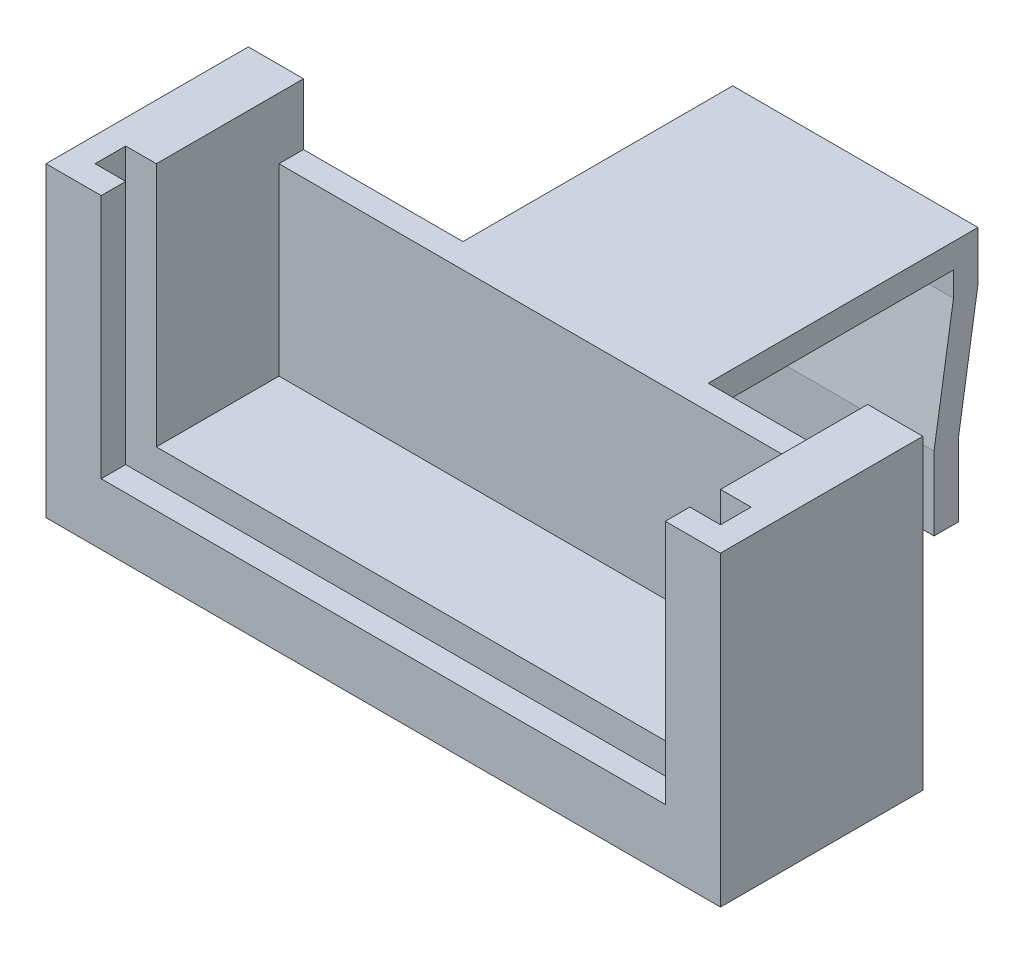
ISO-10303-21;
HEADER;
FILE_DESCRIPTION(('STEP AP214'),'2;1');
FILE_NAME('part.step','',(''),(''),'','','');
FILE_SCHEMA(('AUTOMOTIVE_DESIGN { 1 0 10303 214 1 1 1 1 }'));
ENDSEC;
DATA;
#1=APPLICATION_CONTEXT('core data for automotive mechanical design processes');
#2=APPLICATION_PROTOCOL_DEFINITION('international standard','automotive_design',2000,#1);
#3=PRODUCT_CONTEXT('',#1,'mechanical');
#4=PRODUCT('Part','Part','',(#3));
#5=PRODUCT_RELATED_PRODUCT_CATEGORY('part','',(#4));
#6=PRODUCT_DEFINITION_FORMATION('','',#4);
#7=PRODUCT_DEFINITION_CONTEXT('part definition',#1,'design');
#8=PRODUCT_DEFINITION('design','',#6,#7);
#9=PRODUCT_DEFINITION_SHAPE('','',#8);
#10=(LENGTH_UNIT() NAMED_UNIT(*) SI_UNIT(.MILLI.,.METRE.));
#11=(NAMED_UNIT(*) PLANE_ANGLE_UNIT() SI_UNIT($,.RADIAN.));
#12=(NAMED_UNIT(*) SI_UNIT($,.STERADIAN.) SOLID_ANGLE_UNIT());
#13=UNCERTAINTY_MEASURE_WITH_UNIT(LENGTH_MEASURE(1.E-05),#10,'distance_accuracy_value','');
#14=(GEOMETRIC_REPRESENTATION_CONTEXT(3) GLOBAL_UNCERTAINTY_ASSIGNED_CONTEXT((#13)) GLOBAL_UNIT_ASSIGNED_CONTEXT((#10,
#11,#12)) REPRESENTATION_CONTEXT('',''));
#15=CARTESIAN_POINT('',(0.,0.,0.));
#16=DIRECTION('',(0.,0.,1.));
#17=DIRECTION('',(1.,0.,0.));
#18=AXIS2_PLACEMENT_3D('',#15,#16,#17);
#19=CARTESIAN_POINT('',(37.5,18.,-22.));
#20=DIRECTION('',(0.,1.,0.));
#21=DIRECTION('',(-1.,0.,0.));
#22=AXIS2_PLACEMENT_3D('',#19,#20,#21);
#23=PLANE('',#22);
#24=DIRECTION('',(-1.,0.,0.));
#25=VECTOR('',#24,1.);
#26=CARTESIAN_POINT('',(17.5,18.,-20.));
#27=LINE('',#26,#25);
#28=CARTESIAN_POINT('',(37.5,18.,-20.));
#29=VERTEX_POINT('',#28);
#30=CARTESIAN_POINT('',(17.5,18.,-20.));
#31=VERTEX_POINT('',#30);
#32=EDGE_CURVE('E287',#29,#31,#27,.T.);
#33=ORIENTED_EDGE('',*,*,#32,.F.);
#34=DIRECTION('',(0.,0.,1.));
#35=VECTOR('',#34,1.);
#36=CARTESIAN_POINT('',(37.5,18.,-22.));
#37=LINE('',#36,#35);
#38=CARTESIAN_POINT('',(37.5,18.,0.));
#39=VERTEX_POINT('',#38);
#40=EDGE_CURVE('E61',#29,#39,#37,.T.);
#41=ORIENTED_EDGE('',*,*,#40,.T.);
#42=DIRECTION('',(-1.,0.,0.));
#43=VECTOR('',#42,1.);
#44=CARTESIAN_POINT('',(37.5,18.,0.));
#45=LINE('',#44,#43);
#46=CARTESIAN_POINT('',(17.5,18.,0.));
#47=VERTEX_POINT('',#46);
#48=EDGE_CURVE('E316',#39,#47,#45,.T.);
#49=ORIENTED_EDGE('',*,*,#48,.T.);
#50=DIRECTION('',(0.,0.,1.));
#51=VECTOR('',#50,1.);
#52=CARTESIAN_POINT('',(17.5,18.,-22.));
#53=LINE('',#52,#51);
#54=EDGE_CURVE('E329',#31,#47,#53,.T.);
#55=ORIENTED_EDGE('',*,*,#54,.F.);
#56=EDGE_LOOP('',(#33,#41,#49,#55));
#57=FACE_BOUND('',#56,.T.);
#58=ADVANCED_FACE('F45',(#57),#23,.F.);
#59=CARTESIAN_POINT('',(0.,25.,16.5));
#60=DIRECTION('',(0.,-1.,0.));
#61=DIRECTION('',(0.,0.,-1.));
#62=AXIS2_PLACEMENT_3D('',#59,#60,#61);
#63=PLANE('',#62);
#64=DIRECTION('',(0.,0.,1.));
#65=VECTOR('',#64,1.);
#66=CARTESIAN_POINT('',(4.5,25.,2.));
#67=LINE('',#66,#65);
#68=CARTESIAN_POINT('',(4.5,25.,0.));
#69=VERTEX_POINT('',#68);
#70=CARTESIAN_POINT('',(4.5,25.,12.));
#71=VERTEX_POINT('',#70);
#72=EDGE_CURVE('E467',#69,#71,#67,.T.);
#73=ORIENTED_EDGE('',*,*,#72,.F.);
#74=DIRECTION('',(-1.,0.,0.));
#75=VECTOR('',#74,1.);
#76=CARTESIAN_POINT('',(0.,25.,0.));
#77=LINE('',#76,#75);
#78=CARTESIAN_POINT('',(0.,25.,0.));
#79=VERTEX_POINT('',#78);
#80=EDGE_CURVE('E497',#69,#79,#77,.T.);
#81=ORIENTED_EDGE('',*,*,#80,.T.);
#82=DIRECTION('',(0.,0.,-1.));
#83=VECTOR('',#82,1.);
#84=CARTESIAN_POINT('',(0.,25.,16.5));
#85=LINE('',#84,#83);
#86=CARTESIAN_POINT('',(0.,25.,16.5));
#87=VERTEX_POINT('',#86);
#88=EDGE_CURVE('E487',#87,#79,#85,.T.);
#89=ORIENTED_EDGE('',*,*,#88,.F.);
#90=DIRECTION('',(-1.,0.,0.));
#91=VECTOR('',#90,1.);
#92=CARTESIAN_POINT('',(0.,25.,16.5));
#93=LINE('',#92,#91);
#94=CARTESIAN_POINT('',(4.5,25.,16.5));
#95=VERTEX_POINT('',#94);
#96=EDGE_CURVE('E482',#95,#87,#93,.T.);
#97=ORIENTED_EDGE('',*,*,#96,.F.);
#98=CARTESIAN_POINT('',(4.5,25.,14.5));
#99=VERTEX_POINT('',#98);
#100=EDGE_CURVE('E440',#99,#95,#67,.T.);
#101=ORIENTED_EDGE('',*,*,#100,.F.);
#102=DIRECTION('',(1.,0.,0.));
#103=VECTOR('',#102,1.);
#104=CARTESIAN_POINT('',(2.,25.,14.5));
#105=LINE('',#104,#103);
#106=CARTESIAN_POINT('',(2.,25.,14.5));
#107=VERTEX_POINT('',#106);
#108=EDGE_CURVE('E421',#107,#99,#105,.T.);
#109=ORIENTED_EDGE('',*,*,#108,.F.);
#110=DIRECTION('',(0.,0.,1.));
#111=VECTOR('',#110,1.);
#112=CARTESIAN_POINT('',(2.,25.,14.5));
#113=LINE('',#112,#111);
#114=CARTESIAN_POINT('',(2.,25.,12.));
#115=VERTEX_POINT('',#114);
#116=EDGE_CURVE('E408',#115,#107,#113,.T.);
#117=ORIENTED_EDGE('',*,*,#116,.F.);
#118=DIRECTION('',(1.,0.,0.));
#119=VECTOR('',#118,1.);
#120=CARTESIAN_POINT('',(2.,25.,12.));
#121=LINE('',#120,#119);
#122=EDGE_CURVE('E415',#115,#71,#121,.T.);
#123=ORIENTED_EDGE('',*,*,#122,.T.);
#124=EDGE_LOOP('',(#73,#81,#89,#97,#101,#109,#117,#123));
#125=FACE_BOUND('',#124,.T.);
#126=ADVANCED_FACE('F602',(#125),#63,.F.);
#127=CARTESIAN_POINT('',(4.5,5.,2.));
#128=DIRECTION('',(0.,-1.,0.));
#129=DIRECTION('',(0.,0.,-1.));
#130=AXIS2_PLACEMENT_3D('',#127,#128,#129);
#131=PLANE('',#130);
#132=DIRECTION('',(0.,0.,1.));
#133=VECTOR('',#132,1.);
#134=CARTESIAN_POINT('',(50.5,5.,2.));
#135=LINE('',#134,#133);
#136=CARTESIAN_POINT('',(50.5,5.,14.5));
#137=VERTEX_POINT('',#136);
#138=CARTESIAN_POINT('',(50.5,5.,16.5));
#139=VERTEX_POINT('',#138);
#140=EDGE_CURVE('E461',#137,#139,#135,.T.);
#141=ORIENTED_EDGE('',*,*,#140,.F.);
#142=DIRECTION('',(1.,0.,0.));
#143=VECTOR('',#142,1.);
#144=CARTESIAN_POINT('',(4.5,5.,14.5));
#145=LINE('',#144,#143);
#146=CARTESIAN_POINT('',(4.5,5.,14.5));
#147=VERTEX_POINT('',#146);
#148=EDGE_CURVE('E362',#147,#137,#145,.T.);
#149=ORIENTED_EDGE('',*,*,#148,.F.);
#150=DIRECTION('',(0.,0.,1.));
#151=VECTOR('',#150,1.);
#152=CARTESIAN_POINT('',(4.5,5.,2.));
#153=LINE('',#152,#151);
#154=CARTESIAN_POINT('',(4.5,5.,16.5));
#155=VERTEX_POINT('',#154);
#156=EDGE_CURVE('E466',#147,#155,#153,.T.);
#157=ORIENTED_EDGE('',*,*,#156,.T.);
#158=DIRECTION('',(1.,0.,0.));
#159=VECTOR('',#158,1.);
#160=CARTESIAN_POINT('',(4.5,5.,16.5));
#161=LINE('',#160,#159);
#162=EDGE_CURVE('E444',#155,#139,#161,.T.);
#163=ORIENTED_EDGE('',*,*,#162,.T.);
#164=EDGE_LOOP('',(#141,#149,#157,#163));
#165=FACE_BOUND('',#164,.T.);
#166=ADVANCED_FACE('F596',(#165),#131,.F.);
#167=CARTESIAN_POINT('',(55.,25.,0.));
#168=VERTEX_POINT('',#167);
#169=CARTESIAN_POINT('',(50.5,25.,0.));
#170=VERTEX_POINT('',#169);
#171=EDGE_CURVE('E476',#168,#170,#77,.T.);
#172=ORIENTED_EDGE('',*,*,#171,.T.);
#173=DIRECTION('',(0.,0.,1.));
#174=VECTOR('',#173,1.);
#175=CARTESIAN_POINT('',(50.5,25.,2.));
#176=LINE('',#175,#174);
#177=CARTESIAN_POINT('',(50.5,25.,12.));
#178=VERTEX_POINT('',#177);
#179=EDGE_CURVE('E451',#170,#178,#176,.T.);
#180=ORIENTED_EDGE('',*,*,#179,.T.);
#181=DIRECTION('',(-1.,0.,0.));
#182=VECTOR('',#181,1.);
#183=CARTESIAN_POINT('',(53.,25.,12.));
#184=LINE('',#183,#182);
#185=CARTESIAN_POINT('',(53.,25.,12.));
#186=VERTEX_POINT('',#185);
#187=EDGE_CURVE('E397',#186,#178,#184,.T.);
#188=ORIENTED_EDGE('',*,*,#187,.F.);
#189=DIRECTION('',(0.,0.,1.));
#190=VECTOR('',#189,1.);
#191=CARTESIAN_POINT('',(53.,25.,14.5));
#192=LINE('',#191,#190);
#193=CARTESIAN_POINT('',(53.,25.,14.5));
#194=VERTEX_POINT('',#193);
#195=EDGE_CURVE('E382',#186,#194,#192,.T.);
#196=ORIENTED_EDGE('',*,*,#195,.T.);
#197=DIRECTION('',(-1.,0.,0.));
#198=VECTOR('',#197,1.);
#199=CARTESIAN_POINT('',(53.,25.,14.5));
#200=LINE('',#199,#198);
#201=CARTESIAN_POINT('',(50.5,25.,14.5));
#202=VERTEX_POINT('',#201);
#203=EDGE_CURVE('E390',#194,#202,#200,.T.);
#204=ORIENTED_EDGE('',*,*,#203,.T.);
#205=CARTESIAN_POINT('',(50.5,25.,16.5));
#206=VERTEX_POINT('',#205);
#207=EDGE_CURVE('E456',#202,#206,#176,.T.);
#208=ORIENTED_EDGE('',*,*,#207,.T.);
#209=CARTESIAN_POINT('',(55.,25.,16.5));
#210=VERTEX_POINT('',#209);
#211=EDGE_CURVE('E483',#210,#206,#93,.T.);
#212=ORIENTED_EDGE('',*,*,#211,.F.);
#213=DIRECTION('',(0.,0.,-1.));
#214=VECTOR('',#213,1.);
#215=CARTESIAN_POINT('',(55.,25.,16.5));
#216=LINE('',#215,#214);
#217=EDGE_CURVE('E504',#210,#168,#216,.T.);
#218=ORIENTED_EDGE('',*,*,#217,.T.);
#219=EDGE_LOOP('',(#172,#180,#188,#196,#204,#208,#212,#218));
#220=FACE_BOUND('',#219,.T.);
#221=ADVANCED_FACE('F521',(#220),#63,.F.);
#222=CARTESIAN_POINT('',(50.5,25.,2.));
#223=DIRECTION('',(1.,0.,0.));
#224=DIRECTION('',(0.,0.,-1.));
#225=AXIS2_PLACEMENT_3D('',#222,#223,#224);
#226=PLANE('',#225);
#227=DIRECTION('',(0.,1.,0.));
#228=VECTOR('',#227,1.);
#229=CARTESIAN_POINT('',(50.5,25.,12.));
#230=LINE('',#229,#228);
#231=CARTESIAN_POINT('',(50.5,5.,11.9999999999999));
#232=VERTEX_POINT('',#231);
#233=EDGE_CURVE('E383',#232,#178,#230,.T.);
#234=ORIENTED_EDGE('',*,*,#233,.T.);
#235=ORIENTED_EDGE('',*,*,#179,.F.);
#236=DIRECTION('',(0.,1.,0.));
#237=VECTOR('',#236,1.);
#238=CARTESIAN_POINT('',(50.5,25.,0.));
#239=LINE('',#238,#237);
#240=CARTESIAN_POINT('',(50.5,20.,0.));
#241=VERTEX_POINT('',#240);
#242=EDGE_CURVE('E338',#241,#170,#239,.T.);
#243=ORIENTED_EDGE('',*,*,#242,.F.);
#244=DIRECTION('',(0.,0.,1.));
#245=VECTOR('',#244,1.);
#246=CARTESIAN_POINT('',(50.5,20.,0.));
#247=LINE('',#246,#245);
#248=CARTESIAN_POINT('',(50.5,20.,2.));
#249=VERTEX_POINT('',#248);
#250=EDGE_CURVE('E347',#241,#249,#247,.T.);
#251=ORIENTED_EDGE('',*,*,#250,.T.);
#252=DIRECTION('',(0.,1.,0.));
#253=VECTOR('',#252,1.);
#254=CARTESIAN_POINT('',(50.5,25.,2.));
#255=LINE('',#254,#253);
#256=CARTESIAN_POINT('',(50.5,5.,2.));
#257=VERTEX_POINT('',#256);
#258=EDGE_CURVE('E436',#257,#249,#255,.T.);
#259=ORIENTED_EDGE('',*,*,#258,.F.);
#260=EDGE_CURVE('E457',#257,#232,#135,.T.);
#261=ORIENTED_EDGE('',*,*,#260,.T.);
#262=EDGE_LOOP('',(#234,#235,#243,#251,#259,#261));
#263=FACE_BOUND('',#262,.T.);
#264=ADVANCED_FACE('F577',(#263),#226,.F.);
#265=DIRECTION('',(0.,-1.,0.));
#266=VECTOR('',#265,1.);
#267=CARTESIAN_POINT('',(50.5,5.,14.5));
#268=LINE('',#267,#266);
#269=EDGE_CURVE('E374',#202,#137,#268,.T.);
#270=ORIENTED_EDGE('',*,*,#269,.T.);
#271=ORIENTED_EDGE('',*,*,#140,.T.);
#272=DIRECTION('',(0.,1.,0.));
#273=VECTOR('',#272,1.);
#274=CARTESIAN_POINT('',(50.5,25.,16.5));
#275=LINE('',#274,#273);
#276=EDGE_CURVE('E432',#139,#206,#275,.T.);
#277=ORIENTED_EDGE('',*,*,#276,.T.);
#278=ORIENTED_EDGE('',*,*,#207,.F.);
#279=EDGE_LOOP('',(#270,#271,#277,#278));
#280=FACE_BOUND('',#279,.T.);
#281=ADVANCED_FACE('F594',(#280),#226,.F.);
#282=CARTESIAN_POINT('',(4.5,25.,2.));
#283=DIRECTION('',(-1.,0.,0.));
#284=DIRECTION('',(0.,-1.,0.));
#285=AXIS2_PLACEMENT_3D('',#282,#283,#284);
#286=PLANE('',#285);
#287=ORIENTED_EDGE('',*,*,#156,.F.);
#288=DIRECTION('',(0.,-1.,0.));
#289=VECTOR('',#288,1.);
#290=CARTESIAN_POINT('',(4.5,5.,14.5));
#291=LINE('',#290,#289);
#292=EDGE_CURVE('E409',#99,#147,#291,.T.);
#293=ORIENTED_EDGE('',*,*,#292,.F.);
#294=ORIENTED_EDGE('',*,*,#100,.T.);
#295=DIRECTION('',(0.,-1.,0.));
#296=VECTOR('',#295,1.);
#297=CARTESIAN_POINT('',(4.5,25.,16.5));
#298=LINE('',#297,#296);
#299=EDGE_CURVE('E424',#95,#155,#298,.T.);
#300=ORIENTED_EDGE('',*,*,#299,.T.);
#301=EDGE_LOOP('',(#287,#293,#294,#300));
#302=FACE_BOUND('',#301,.T.);
#303=ADVANCED_FACE('F607',(#302),#286,.F.);
#304=CARTESIAN_POINT('',(0.,0.,16.5));
#305=DIRECTION('',(1.,0.,0.));
#306=DIRECTION('',(0.,0.,-1.));
#307=AXIS2_PLACEMENT_3D('',#304,#305,#306);
#308=PLANE('',#307);
#309=DIRECTION('',(0.,-1.,0.));
#310=VECTOR('',#309,1.);
#311=CARTESIAN_POINT('',(0.,0.,0.));
#312=LINE('',#311,#310);
#313=CARTESIAN_POINT('',(0.,0.,0.));
#314=VERTEX_POINT('',#313);
#315=EDGE_CURVE('E455',#79,#314,#312,.T.);
#316=ORIENTED_EDGE('',*,*,#315,.T.);
#317=DIRECTION('',(0.,0.,-1.));
#318=VECTOR('',#317,1.);
#319=CARTESIAN_POINT('',(0.,0.,16.5));
#320=LINE('',#319,#318);
#321=CARTESIAN_POINT('',(0.,0.,16.5));
#322=VERTEX_POINT('',#321);
#323=EDGE_CURVE('E11',#322,#314,#320,.T.);
#324=ORIENTED_EDGE('',*,*,#323,.F.);
#325=DIRECTION('',(0.,-1.,0.));
#326=VECTOR('',#325,1.);
#327=CARTESIAN_POINT('',(0.,0.,16.5));
#328=LINE('',#327,#326);
#329=EDGE_CURVE('E471',#87,#322,#328,.T.);
#330=ORIENTED_EDGE('',*,*,#329,.F.);
#331=ORIENTED_EDGE('',*,*,#88,.T.);
#332=EDGE_LOOP('',(#316,#324,#330,#331));
#333=FACE_BOUND('',#332,.T.);
#334=ADVANCED_FACE('F47',(#333),#308,.F.);
#335=CARTESIAN_POINT('',(0.,0.,16.5));
#336=DIRECTION('',(0.,1.,0.));
#337=DIRECTION('',(0.,0.,1.));
#338=AXIS2_PLACEMENT_3D('',#335,#336,#337);
#339=PLANE('',#338);
#340=DIRECTION('',(1.,0.,0.));
#341=VECTOR('',#340,1.);
#342=CARTESIAN_POINT('',(0.,0.,0.));
#343=LINE('',#342,#341);
#344=CARTESIAN_POINT('',(55.,0.,0.));
#345=VERTEX_POINT('',#344);
#346=EDGE_CURVE('E491',#314,#345,#343,.T.);
#347=ORIENTED_EDGE('',*,*,#346,.T.);
#348=DIRECTION('',(0.,0.,-1.));
#349=VECTOR('',#348,1.);
#350=CARTESIAN_POINT('',(55.,0.,16.5));
#351=LINE('',#350,#349);
#352=CARTESIAN_POINT('',(55.,0.,16.5));
#353=VERTEX_POINT('',#352);
#354=EDGE_CURVE('E54',#353,#345,#351,.T.);
#355=ORIENTED_EDGE('',*,*,#354,.F.);
#356=DIRECTION('',(1.,0.,0.));
#357=VECTOR('',#356,1.);
#358=CARTESIAN_POINT('',(0.,0.,16.5));
#359=LINE('',#358,#357);
#360=EDGE_CURVE('E475',#322,#353,#359,.T.);
#361=ORIENTED_EDGE('',*,*,#360,.F.);
#362=ORIENTED_EDGE('',*,*,#323,.T.);
#363=EDGE_LOOP('',(#347,#355,#361,#362));
#364=FACE_BOUND('',#363,.T.);
#365=ADVANCED_FACE('F531',(#364),#339,.F.);
#366=CARTESIAN_POINT('',(55.,0.,16.5));
#367=DIRECTION('',(-1.,0.,0.));
#368=DIRECTION('',(0.,0.,1.));
#369=AXIS2_PLACEMENT_3D('',#366,#367,#368);
#370=PLANE('',#369);
#371=DIRECTION('',(0.,1.,0.));
#372=VECTOR('',#371,1.);
#373=CARTESIAN_POINT('',(55.,0.,0.));
#374=LINE('',#373,#372);
#375=EDGE_CURVE('E494',#345,#168,#374,.T.);
#376=ORIENTED_EDGE('',*,*,#375,.T.);
#377=ORIENTED_EDGE('',*,*,#217,.F.);
#378=DIRECTION('',(0.,1.,0.));
#379=VECTOR('',#378,1.);
#380=CARTESIAN_POINT('',(55.,0.,16.5));
#381=LINE('',#380,#379);
#382=EDGE_CURVE('E479',#353,#210,#381,.T.);
#383=ORIENTED_EDGE('',*,*,#382,.F.);
#384=ORIENTED_EDGE('',*,*,#354,.T.);
#385=EDGE_LOOP('',(#376,#377,#383,#384));
#386=FACE_BOUND('',#385,.T.);
#387=ADVANCED_FACE('F513',(#386),#370,.F.);
#388=CARTESIAN_POINT('',(0.,0.,16.5));
#389=DIRECTION('',(0.,0.,-1.));
#390=DIRECTION('',(-1.,0.,0.));
#391=AXIS2_PLACEMENT_3D('',#388,#389,#390);
#392=PLANE('',#391);
#393=ORIENTED_EDGE('',*,*,#211,.T.);
#394=ORIENTED_EDGE('',*,*,#276,.F.);
#395=ORIENTED_EDGE('',*,*,#162,.F.);
#396=ORIENTED_EDGE('',*,*,#299,.F.);
#397=ORIENTED_EDGE('',*,*,#96,.T.);
#398=ORIENTED_EDGE('',*,*,#329,.T.);
#399=ORIENTED_EDGE('',*,*,#360,.T.);
#400=ORIENTED_EDGE('',*,*,#382,.T.);
#401=EDGE_LOOP('',(#393,#394,#395,#396,#397,#398,#399,#400));
#402=FACE_BOUND('',#401,.T.);
#403=ADVANCED_FACE('F527',(#402),#392,.F.);
#404=CARTESIAN_POINT('',(0.,0.,0.));
#405=DIRECTION('',(0.,0.,-1.));
#406=DIRECTION('',(-1.,0.,0.));
#407=AXIS2_PLACEMENT_3D('',#404,#405,#406);
#408=PLANE('',#407);
#409=DIRECTION('',(0.,-1.,0.));
#410=VECTOR('',#409,1.);
#411=CARTESIAN_POINT('',(37.5,18.,0.));
#412=LINE('',#411,#410);
#413=CARTESIAN_POINT('',(37.5,20.,0.));
#414=VERTEX_POINT('',#413);
#415=EDGE_CURVE('E68',#414,#39,#412,.T.);
#416=ORIENTED_EDGE('',*,*,#415,.F.);
#417=DIRECTION('',(1.,0.,0.));
#418=VECTOR('',#417,1.);
#419=CARTESIAN_POINT('',(50.5,20.,0.));
#420=LINE('',#419,#418);
#421=EDGE_CURVE('E339',#414,#241,#420,.T.);
#422=ORIENTED_EDGE('',*,*,#421,.T.);
#423=ORIENTED_EDGE('',*,*,#242,.T.);
#424=ORIENTED_EDGE('',*,*,#171,.F.);
#425=ORIENTED_EDGE('',*,*,#375,.F.);
#426=ORIENTED_EDGE('',*,*,#346,.F.);
#427=ORIENTED_EDGE('',*,*,#315,.F.);
#428=ORIENTED_EDGE('',*,*,#80,.F.);
#429=DIRECTION('',(0.,-1.,0.));
#430=VECTOR('',#429,1.);
#431=CARTESIAN_POINT('',(4.5,20.,0.));
#432=LINE('',#431,#430);
#433=CARTESIAN_POINT('',(4.5,20.,0.));
#434=VERTEX_POINT('',#433);
#435=EDGE_CURVE('E343',#69,#434,#432,.T.);
#436=ORIENTED_EDGE('',*,*,#435,.T.);
#437=CARTESIAN_POINT('',(17.5,20.,0.));
#438=VERTEX_POINT('',#437);
#439=EDGE_CURVE('E335',#434,#438,#420,.T.);
#440=ORIENTED_EDGE('',*,*,#439,.T.);
#441=DIRECTION('',(0.,1.,0.));
#442=VECTOR('',#441,1.);
#443=CARTESIAN_POINT('',(17.5,18.,0.));
#444=LINE('',#443,#442);
#445=EDGE_CURVE('E307',#47,#438,#444,.T.);
#446=ORIENTED_EDGE('',*,*,#445,.F.);
#447=ORIENTED_EDGE('',*,*,#48,.F.);
#448=EDGE_LOOP('',(#416,#422,#423,#424,#425,#426,#427,#428,#436,#440,#446,#447));
#449=FACE_BOUND('',#448,.T.);
#450=ADVANCED_FACE('F517',(#449),#408,.T.);
#451=CARTESIAN_POINT('',(4.5,5.,2.));
#452=VERTEX_POINT('',#451);
#453=CARTESIAN_POINT('',(4.5,5.,12.));
#454=VERTEX_POINT('',#453);
#455=EDGE_CURVE('E462',#452,#454,#153,.T.);
#456=ORIENTED_EDGE('',*,*,#455,.T.);
#457=DIRECTION('',(-1.,0.,0.));
#458=VECTOR('',#457,1.);
#459=CARTESIAN_POINT('',(4.5,5.,12.));
#460=LINE('',#459,#458);
#461=EDGE_CURVE('E354',#232,#454,#460,.T.);
#462=ORIENTED_EDGE('',*,*,#461,.F.);
#463=ORIENTED_EDGE('',*,*,#260,.F.);
#464=DIRECTION('',(1.,0.,0.));
#465=VECTOR('',#464,1.);
#466=CARTESIAN_POINT('',(4.5,5.,2.));
#467=LINE('',#466,#465);
#468=EDGE_CURVE('E431',#452,#257,#467,.T.);
#469=ORIENTED_EDGE('',*,*,#468,.F.);
#470=EDGE_LOOP('',(#456,#462,#463,#469));
#471=FACE_BOUND('',#470,.T.);
#472=ADVANCED_FACE('F620',(#471),#131,.F.);
#473=ORIENTED_EDGE('',*,*,#72,.T.);
#474=DIRECTION('',(0.,1.,0.));
#475=VECTOR('',#474,1.);
#476=CARTESIAN_POINT('',(4.5,25.,12.));
#477=LINE('',#476,#475);
#478=EDGE_CURVE('E400',#454,#71,#477,.T.);
#479=ORIENTED_EDGE('',*,*,#478,.F.);
#480=ORIENTED_EDGE('',*,*,#455,.F.);
#481=DIRECTION('',(0.,-1.,0.));
#482=VECTOR('',#481,1.);
#483=CARTESIAN_POINT('',(4.5,25.,2.));
#484=LINE('',#483,#482);
#485=CARTESIAN_POINT('',(4.5,20.,2.));
#486=VERTEX_POINT('',#485);
#487=EDGE_CURVE('E428',#486,#452,#484,.T.);
#488=ORIENTED_EDGE('',*,*,#487,.F.);
#489=DIRECTION('',(0.,0.,1.));
#490=VECTOR('',#489,1.);
#491=CARTESIAN_POINT('',(4.5,20.,0.));
#492=LINE('',#491,#490);
#493=EDGE_CURVE('E351',#434,#486,#492,.T.);
#494=ORIENTED_EDGE('',*,*,#493,.F.);
#495=ORIENTED_EDGE('',*,*,#435,.F.);
#496=EDGE_LOOP('',(#473,#479,#480,#488,#494,#495));
#497=FACE_BOUND('',#496,.T.);
#498=ADVANCED_FACE('F612',(#497),#286,.F.);
#499=CARTESIAN_POINT('',(0.,0.,2.));
#500=DIRECTION('',(0.,0.,-1.));
#501=DIRECTION('',(-1.,0.,0.));
#502=AXIS2_PLACEMENT_3D('',#499,#500,#501);
#503=PLANE('',#502);
#504=ORIENTED_EDGE('',*,*,#258,.T.);
#505=DIRECTION('',(1.,0.,0.));
#506=VECTOR('',#505,1.);
#507=CARTESIAN_POINT('',(27.5,20.,2.));
#508=LINE('',#507,#506);
#509=EDGE_CURVE('E334',#486,#249,#508,.T.);
#510=ORIENTED_EDGE('',*,*,#509,.F.);
#511=ORIENTED_EDGE('',*,*,#487,.T.);
#512=ORIENTED_EDGE('',*,*,#468,.T.);
#513=EDGE_LOOP('',(#504,#510,#511,#512));
#514=FACE_BOUND('',#513,.T.);
#515=ADVANCED_FACE('F617',(#514),#503,.F.);
#516=CARTESIAN_POINT('',(2.,5.,14.5));
#517=DIRECTION('',(0.,0.,1.));
#518=DIRECTION('',(1.,0.,0.));
#519=AXIS2_PLACEMENT_3D('',#516,#517,#518);
#520=PLANE('',#519);
#521=ORIENTED_EDGE('',*,*,#292,.T.);
#522=ORIENTED_EDGE('',*,*,#148,.T.);
#523=ORIENTED_EDGE('',*,*,#269,.F.);
#524=ORIENTED_EDGE('',*,*,#203,.F.);
#525=DIRECTION('',(0.,-1.,0.));
#526=VECTOR('',#525,1.);
#527=CARTESIAN_POINT('',(53.,5.,14.5));
#528=LINE('',#527,#526);
#529=CARTESIAN_POINT('',(53.,2.,14.5));
#530=VERTEX_POINT('',#529);
#531=EDGE_CURVE('E379',#194,#530,#528,.T.);
#532=ORIENTED_EDGE('',*,*,#531,.T.);
#533=DIRECTION('',(1.,0.,0.));
#534=VECTOR('',#533,1.);
#535=CARTESIAN_POINT('',(50.5,2.,14.5));
#536=LINE('',#535,#534);
#537=CARTESIAN_POINT('',(2.,2.,14.5));
#538=VERTEX_POINT('',#537);
#539=EDGE_CURVE('E357',#538,#530,#536,.T.);
#540=ORIENTED_EDGE('',*,*,#539,.F.);
#541=DIRECTION('',(0.,-1.,0.));
#542=VECTOR('',#541,1.);
#543=CARTESIAN_POINT('',(2.,5.,14.5));
#544=LINE('',#543,#542);
#545=EDGE_CURVE('E412',#107,#538,#544,.T.);
#546=ORIENTED_EDGE('',*,*,#545,.F.);
#547=ORIENTED_EDGE('',*,*,#108,.T.);
#548=EDGE_LOOP('',(#521,#522,#523,#524,#532,#540,#546,#547));
#549=FACE_BOUND('',#548,.T.);
#550=ADVANCED_FACE('F590',(#549),#520,.F.);
#551=CARTESIAN_POINT('',(2.,25.,12.));
#552=DIRECTION('',(0.,0.,-1.));
#553=DIRECTION('',(0.,1.,0.));
#554=AXIS2_PLACEMENT_3D('',#551,#552,#553);
#555=PLANE('',#554);
#556=ORIENTED_EDGE('',*,*,#478,.T.);
#557=ORIENTED_EDGE('',*,*,#122,.F.);
#558=DIRECTION('',(0.,1.,0.));
#559=VECTOR('',#558,1.);
#560=CARTESIAN_POINT('',(2.,25.,12.));
#561=LINE('',#560,#559);
#562=CARTESIAN_POINT('',(2.,2.,12.));
#563=VERTEX_POINT('',#562);
#564=EDGE_CURVE('E404',#563,#115,#561,.T.);
#565=ORIENTED_EDGE('',*,*,#564,.F.);
#566=DIRECTION('',(-1.,0.,0.));
#567=VECTOR('',#566,1.);
#568=CARTESIAN_POINT('',(53.,2.,12.));
#569=LINE('',#568,#567);
#570=CARTESIAN_POINT('',(53.,2.,12.));
#571=VERTEX_POINT('',#570);
#572=EDGE_CURVE('E366',#571,#563,#569,.T.);
#573=ORIENTED_EDGE('',*,*,#572,.F.);
#574=DIRECTION('',(0.,1.,0.));
#575=VECTOR('',#574,1.);
#576=CARTESIAN_POINT('',(53.,25.,12.));
#577=LINE('',#576,#575);
#578=EDGE_CURVE('E387',#571,#186,#577,.T.);
#579=ORIENTED_EDGE('',*,*,#578,.T.);
#580=ORIENTED_EDGE('',*,*,#187,.T.);
#581=ORIENTED_EDGE('',*,*,#233,.F.);
#582=ORIENTED_EDGE('',*,*,#461,.T.);
#583=EDGE_LOOP('',(#556,#557,#565,#573,#579,#580,#581,#582));
#584=FACE_BOUND('',#583,.T.);
#585=ADVANCED_FACE('F580',(#584),#555,.F.);
#586=CARTESIAN_POINT('',(2.,0.,0.));
#587=DIRECTION('',(-1.,0.,0.));
#588=DIRECTION('',(0.,-1.,0.));
#589=AXIS2_PLACEMENT_3D('',#586,#587,#588);
#590=PLANE('',#589);
#591=ORIENTED_EDGE('',*,*,#545,.T.);
#592=DIRECTION('',(0.,0.,1.));
#593=VECTOR('',#592,1.);
#594=CARTESIAN_POINT('',(2.,2.,12.));
#595=LINE('',#594,#593);
#596=EDGE_CURVE('E370',#563,#538,#595,.T.);
#597=ORIENTED_EDGE('',*,*,#596,.F.);
#598=ORIENTED_EDGE('',*,*,#564,.T.);
#599=ORIENTED_EDGE('',*,*,#116,.T.);
#600=EDGE_LOOP('',(#591,#597,#598,#599));
#601=FACE_BOUND('',#600,.T.);
#602=ADVANCED_FACE('F610',(#601),#590,.F.);
#603=CARTESIAN_POINT('',(53.,0.,0.));
#604=DIRECTION('',(1.,0.,0.));
#605=DIRECTION('',(0.,-1.,0.));
#606=AXIS2_PLACEMENT_3D('',#603,#604,#605);
#607=PLANE('',#606);
#608=ORIENTED_EDGE('',*,*,#578,.F.);
#609=DIRECTION('',(0.,0.,-1.));
#610=VECTOR('',#609,1.);
#611=CARTESIAN_POINT('',(53.,2.,14.5));
#612=LINE('',#611,#610);
#613=EDGE_CURVE('E361',#530,#571,#612,.T.);
#614=ORIENTED_EDGE('',*,*,#613,.F.);
#615=ORIENTED_EDGE('',*,*,#531,.F.);
#616=ORIENTED_EDGE('',*,*,#195,.F.);
#617=EDGE_LOOP('',(#608,#614,#615,#616));
#618=FACE_BOUND('',#617,.T.);
#619=ADVANCED_FACE('F586',(#618),#607,.F.);
#620=CARTESIAN_POINT('',(0.,2.,0.));
#621=DIRECTION('',(0.,1.,0.));
#622=DIRECTION('',(0.,0.,1.));
#623=AXIS2_PLACEMENT_3D('',#620,#621,#622);
#624=PLANE('',#623);
#625=ORIENTED_EDGE('',*,*,#539,.T.);
#626=ORIENTED_EDGE('',*,*,#613,.T.);
#627=ORIENTED_EDGE('',*,*,#572,.T.);
#628=ORIENTED_EDGE('',*,*,#596,.T.);
#629=EDGE_LOOP('',(#625,#626,#627,#628));
#630=FACE_BOUND('',#629,.T.);
#631=ADVANCED_FACE('F646',(#630),#624,.T.);
#632=CARTESIAN_POINT('',(27.5,20.,0.));
#633=DIRECTION('',(0.,-1.,0.));
#634=DIRECTION('',(0.,0.,-1.));
#635=AXIS2_PLACEMENT_3D('',#632,#633,#634);
#636=PLANE('',#635);
#637=ORIENTED_EDGE('',*,*,#509,.T.);
#638=ORIENTED_EDGE('',*,*,#250,.F.);
#639=ORIENTED_EDGE('',*,*,#421,.F.);
#640=DIRECTION('',(0.,0.,1.));
#641=VECTOR('',#640,1.);
#642=CARTESIAN_POINT('',(37.5,20.,-22.));
#643=LINE('',#642,#641);
#644=CARTESIAN_POINT('',(37.5,20.,-22.));
#645=VERTEX_POINT('',#644);
#646=EDGE_CURVE('E313',#645,#414,#643,.T.);
#647=ORIENTED_EDGE('',*,*,#646,.F.);
#648=DIRECTION('',(1.,0.,0.));
#649=VECTOR('',#648,1.);
#650=CARTESIAN_POINT('',(37.5,20.,-22.));
#651=LINE('',#650,#649);
#652=CARTESIAN_POINT('',(17.5,20.,-22.));
#653=VERTEX_POINT('',#652);
#654=EDGE_CURVE('E310',#653,#645,#651,.T.);
#655=ORIENTED_EDGE('',*,*,#654,.F.);
#656=DIRECTION('',(0.,0.,1.));
#657=VECTOR('',#656,1.);
#658=CARTESIAN_POINT('',(17.5,20.,-22.));
#659=LINE('',#658,#657);
#660=EDGE_CURVE('E325',#653,#438,#659,.T.);
#661=ORIENTED_EDGE('',*,*,#660,.T.);
#662=ORIENTED_EDGE('',*,*,#439,.F.);
#663=ORIENTED_EDGE('',*,*,#493,.T.);
#664=EDGE_LOOP('',(#637,#638,#639,#647,#655,#661,#662,#663));
#665=FACE_BOUND('',#664,.T.);
#666=ADVANCED_FACE('F572',(#665),#636,.F.);
#667=CARTESIAN_POINT('',(37.5,18.,-22.));
#668=DIRECTION('',(-1.,0.,0.));
#669=DIRECTION('',(0.,0.,1.));
#670=AXIS2_PLACEMENT_3D('',#667,#668,#669);
#671=PLANE('',#670);
#672=ORIENTED_EDGE('',*,*,#415,.T.);
#673=ORIENTED_EDGE('',*,*,#40,.F.);
#674=DIRECTION('',(0.,1.,0.));
#675=VECTOR('',#674,1.);
#676=CARTESIAN_POINT('',(37.5,16.,-20.));
#677=LINE('',#676,#675);
#678=CARTESIAN_POINT('',(37.5,16.,-20.));
#679=VERTEX_POINT('',#678);
#680=EDGE_CURVE('E259',#679,#29,#677,.T.);
#681=ORIENTED_EDGE('',*,*,#680,.F.);
#682=DIRECTION('',(0.,-0.987688340595139,0.156434465040224));
#683=VECTOR('',#682,1.);
#684=CARTESIAN_POINT('',(37.5,16.,-20.));
#685=LINE('',#684,#683);
#686=CARTESIAN_POINT('',(37.5,6.,-18.4161555967547));
#687=VERTEX_POINT('',#686);
#688=EDGE_CURVE('E239',#679,#687,#685,.T.);
#689=ORIENTED_EDGE('',*,*,#688,.T.);
#690=DIRECTION('',(0.,-1.,0.));
#691=VECTOR('',#690,1.);
#692=CARTESIAN_POINT('',(37.5,6.,-18.4161555967547));
#693=LINE('',#692,#691);
#694=CARTESIAN_POINT('',(37.5,0.,-18.4161555967547));
#695=VERTEX_POINT('',#694);
#696=EDGE_CURVE('E249',#687,#695,#693,.T.);
#697=ORIENTED_EDGE('',*,*,#696,.T.);
#698=DIRECTION('',(0.,0.,-1.));
#699=VECTOR('',#698,1.);
#700=CARTESIAN_POINT('',(37.5,0.,-18.4161555967547));
#701=LINE('',#700,#699);
#702=CARTESIAN_POINT('',(37.5,0.,-20.4161555967547));
#703=VERTEX_POINT('',#702);
#704=EDGE_CURVE('E256',#695,#703,#701,.T.);
#705=ORIENTED_EDGE('',*,*,#704,.T.);
#706=DIRECTION('',(0.,1.,0.));
#707=VECTOR('',#706,1.);
#708=CARTESIAN_POINT('',(37.5,0.,-20.4161555967547));
#709=LINE('',#708,#707);
#710=CARTESIAN_POINT('',(37.5,6.00000000000001,-20.4161555967547));
#711=VERTEX_POINT('',#710);
#712=EDGE_CURVE('E269',#703,#711,#709,.T.);
#713=ORIENTED_EDGE('',*,*,#712,.T.);
#714=DIRECTION('',(0.,0.987688340595139,-0.156434465040224));
#715=VECTOR('',#714,1.);
#716=CARTESIAN_POINT('',(37.5,6.00000000000001,-20.4161555967547));
#717=LINE('',#716,#715);
#718=CARTESIAN_POINT('',(37.5,16.,-22.));
#719=VERTEX_POINT('',#718);
#720=EDGE_CURVE('E246',#711,#719,#717,.T.);
#721=ORIENTED_EDGE('',*,*,#720,.T.);
#722=DIRECTION('',(0.,-1.,0.));
#723=VECTOR('',#722,1.);
#724=CARTESIAN_POINT('',(37.5,18.,-22.));
#725=LINE('',#724,#723);
#726=EDGE_CURVE('E303',#645,#719,#725,.T.);
#727=ORIENTED_EDGE('',*,*,#726,.F.);
#728=ORIENTED_EDGE('',*,*,#646,.T.);
#729=EDGE_LOOP('',(#672,#673,#681,#689,#697,#705,#713,#721,#727,#728));
#730=FACE_BOUND('',#729,.T.);
#731=ADVANCED_FACE('F258',(#730),#671,.F.);
#732=CARTESIAN_POINT('',(17.5,18.,-22.));
#733=DIRECTION('',(1.,0.,0.));
#734=DIRECTION('',(0.,0.,-1.));
#735=AXIS2_PLACEMENT_3D('',#732,#733,#734);
#736=PLANE('',#735);
#737=ORIENTED_EDGE('',*,*,#445,.T.);
#738=ORIENTED_EDGE('',*,*,#660,.F.);
#739=DIRECTION('',(0.,1.,0.));
#740=VECTOR('',#739,1.);
#741=CARTESIAN_POINT('',(17.5,18.,-22.));
#742=LINE('',#741,#740);
#743=CARTESIAN_POINT('',(17.5,16.,-22.));
#744=VERTEX_POINT('',#743);
#745=EDGE_CURVE('E306',#744,#653,#742,.T.);
#746=ORIENTED_EDGE('',*,*,#745,.F.);
#747=DIRECTION('',(0.,-0.987688340595139,0.156434465040224));
#748=VECTOR('',#747,1.);
#749=CARTESIAN_POINT('',(17.5,6.00000000000001,-20.4161555967547));
#750=LINE('',#749,#748);
#751=CARTESIAN_POINT('',(17.5,6.00000000000001,-20.4161555967547));
#752=VERTEX_POINT('',#751);
#753=EDGE_CURVE('E264',#744,#752,#750,.T.);
#754=ORIENTED_EDGE('',*,*,#753,.T.);
#755=DIRECTION('',(0.,-1.,0.));
#756=VECTOR('',#755,1.);
#757=CARTESIAN_POINT('',(17.5,0.,-20.4161555967547));
#758=LINE('',#757,#756);
#759=CARTESIAN_POINT('',(17.5,0.,-20.4161555967547));
#760=VERTEX_POINT('',#759);
#761=EDGE_CURVE('E545',#752,#760,#758,.T.);
#762=ORIENTED_EDGE('',*,*,#761,.T.);
#763=DIRECTION('',(0.,0.,1.));
#764=VECTOR('',#763,1.);
#765=CARTESIAN_POINT('',(17.5,0.,-18.4161555967547));
#766=LINE('',#765,#764);
#767=CARTESIAN_POINT('',(17.5,0.,-18.4161555967547));
#768=VERTEX_POINT('',#767);
#769=EDGE_CURVE('E547',#760,#768,#766,.T.);
#770=ORIENTED_EDGE('',*,*,#769,.T.);
#771=DIRECTION('',(0.,1.,0.));
#772=VECTOR('',#771,1.);
#773=CARTESIAN_POINT('',(17.5,6.,-18.4161555967547));
#774=LINE('',#773,#772);
#775=CARTESIAN_POINT('',(17.5,6.,-18.4161555967547));
#776=VERTEX_POINT('',#775);
#777=EDGE_CURVE('E279',#768,#776,#774,.T.);
#778=ORIENTED_EDGE('',*,*,#777,.T.);
#779=DIRECTION('',(0.,0.987688340595139,-0.156434465040224));
#780=VECTOR('',#779,1.);
#781=CARTESIAN_POINT('',(17.5,16.,-20.));
#782=LINE('',#781,#780);
#783=CARTESIAN_POINT('',(17.5,16.,-20.));
#784=VERTEX_POINT('',#783);
#785=EDGE_CURVE('E241',#776,#784,#782,.T.);
#786=ORIENTED_EDGE('',*,*,#785,.T.);
#787=DIRECTION('',(0.,1.,0.));
#788=VECTOR('',#787,1.);
#789=CARTESIAN_POINT('',(17.5,16.,-20.));
#790=LINE('',#789,#788);
#791=EDGE_CURVE('E295',#784,#31,#790,.T.);
#792=ORIENTED_EDGE('',*,*,#791,.T.);
#793=ORIENTED_EDGE('',*,*,#54,.T.);
#794=EDGE_LOOP('',(#737,#738,#746,#754,#762,#770,#778,#786,#792,#793));
#795=FACE_BOUND('',#794,.T.);
#796=ADVANCED_FACE('F552',(#795),#736,.F.);
#797=CARTESIAN_POINT('',(0.,0.,-22.));
#798=DIRECTION('',(0.,0.,1.));
#799=DIRECTION('',(1.,0.,0.));
#800=AXIS2_PLACEMENT_3D('',#797,#798,#799);
#801=PLANE('',#800);
#802=ORIENTED_EDGE('',*,*,#726,.T.);
#803=DIRECTION('',(1.,0.,0.));
#804=VECTOR('',#803,1.);
#805=CARTESIAN_POINT('',(17.5,16.,-22.));
#806=LINE('',#805,#804);
#807=EDGE_CURVE('E288',#744,#719,#806,.T.);
#808=ORIENTED_EDGE('',*,*,#807,.F.);
#809=ORIENTED_EDGE('',*,*,#745,.T.);
#810=ORIENTED_EDGE('',*,*,#654,.T.);
#811=EDGE_LOOP('',(#802,#808,#809,#810));
#812=FACE_BOUND('',#811,.T.);
#813=ADVANCED_FACE('F567',(#812),#801,.F.);
#814=CARTESIAN_POINT('',(17.5,16.,-20.));
#815=DIRECTION('',(0.,0.,-1.));
#816=DIRECTION('',(-1.,0.,0.));
#817=AXIS2_PLACEMENT_3D('',#814,#815,#816);
#818=PLANE('',#817);
#819=ORIENTED_EDGE('',*,*,#32,.T.);
#820=ORIENTED_EDGE('',*,*,#791,.F.);
#821=DIRECTION('',(-1.,0.,0.));
#822=VECTOR('',#821,1.);
#823=CARTESIAN_POINT('',(17.5,16.,-20.));
#824=LINE('',#823,#822);
#825=EDGE_CURVE('E292',#679,#784,#824,.T.);
#826=ORIENTED_EDGE('',*,*,#825,.F.);
#827=ORIENTED_EDGE('',*,*,#680,.T.);
#828=EDGE_LOOP('',(#819,#820,#826,#827));
#829=FACE_BOUND('',#828,.T.);
#830=ADVANCED_FACE('F802',(#829),#818,.F.);
#831=CARTESIAN_POINT('',(1.10353877488582,6.00000000000001,-20.4161555967547));
#832=DIRECTION('',(0.,-0.156434465040224,-0.987688340595139));
#833=DIRECTION('',(0.,0.987688340595139,-0.156434465040224));
#834=AXIS2_PLACEMENT_3D('',#831,#832,#833);
#835=PLANE('',#834);
#836=ORIENTED_EDGE('',*,*,#753,.F.);
#837=ORIENTED_EDGE('',*,*,#807,.T.);
#838=ORIENTED_EDGE('',*,*,#720,.F.);
#839=DIRECTION('',(1.,0.,0.));
#840=VECTOR('',#839,1.);
#841=CARTESIAN_POINT('',(1.10353877488582,6.00000000000001,-20.4161555967547));
#842=LINE('',#841,#840);
#843=EDGE_CURVE('E276',#752,#711,#842,.T.);
#844=ORIENTED_EDGE('',*,*,#843,.F.);
#845=EDGE_LOOP('',(#836,#837,#838,#844));
#846=FACE_BOUND('',#845,.T.);
#847=ADVANCED_FACE('F564',(#846),#835,.T.);
#848=CARTESIAN_POINT('',(1.10353877488582,0.,-20.4161555967547));
#849=DIRECTION('',(0.,0.,-1.));
#850=DIRECTION('',(-1.,0.,0.));
#851=AXIS2_PLACEMENT_3D('',#848,#849,#850);
#852=PLANE('',#851);
#853=ORIENTED_EDGE('',*,*,#761,.F.);
#854=ORIENTED_EDGE('',*,*,#843,.T.);
#855=ORIENTED_EDGE('',*,*,#712,.F.);
#856=DIRECTION('',(1.,0.,0.));
#857=VECTOR('',#856,1.);
#858=CARTESIAN_POINT('',(1.10353877488582,0.,-20.4161555967547));
#859=LINE('',#858,#857);
#860=EDGE_CURVE('E280',#760,#703,#859,.T.);
#861=ORIENTED_EDGE('',*,*,#860,.F.);
#862=EDGE_LOOP('',(#853,#854,#855,#861));
#863=FACE_BOUND('',#862,.T.);
#864=ADVANCED_FACE('F824',(#863),#852,.T.);
#865=CARTESIAN_POINT('',(1.10353877488582,0.,-18.4161555967547));
#866=DIRECTION('',(0.,-1.,0.));
#867=DIRECTION('',(0.,0.,-1.));
#868=AXIS2_PLACEMENT_3D('',#865,#866,#867);
#869=PLANE('',#868);
#870=ORIENTED_EDGE('',*,*,#769,.F.);
#871=ORIENTED_EDGE('',*,*,#860,.T.);
#872=ORIENTED_EDGE('',*,*,#704,.F.);
#873=DIRECTION('',(1.,0.,0.));
#874=VECTOR('',#873,1.);
#875=CARTESIAN_POINT('',(1.10353877488582,0.,-18.4161555967547));
#876=LINE('',#875,#874);
#877=EDGE_CURVE('E245',#768,#695,#876,.T.);
#878=ORIENTED_EDGE('',*,*,#877,.F.);
#879=EDGE_LOOP('',(#870,#871,#872,#878));
#880=FACE_BOUND('',#879,.T.);
#881=ADVANCED_FACE('F555',(#880),#869,.T.);
#882=CARTESIAN_POINT('',(1.10353877488582,6.,-18.4161555967547));
#883=DIRECTION('',(0.,0.,1.));
#884=DIRECTION('',(1.,0.,0.));
#885=AXIS2_PLACEMENT_3D('',#882,#883,#884);
#886=PLANE('',#885);
#887=ORIENTED_EDGE('',*,*,#777,.F.);
#888=ORIENTED_EDGE('',*,*,#877,.T.);
#889=ORIENTED_EDGE('',*,*,#696,.F.);
#890=DIRECTION('',(1.,0.,0.));
#891=VECTOR('',#890,1.);
#892=CARTESIAN_POINT('',(1.10353877488582,6.,-18.4161555967547));
#893=LINE('',#892,#891);
#894=EDGE_CURVE('E234',#776,#687,#893,.T.);
#895=ORIENTED_EDGE('',*,*,#894,.F.);
#896=EDGE_LOOP('',(#887,#888,#889,#895));
#897=FACE_BOUND('',#896,.T.);
#898=ADVANCED_FACE('F250',(#897),#886,.T.);
#899=CARTESIAN_POINT('',(1.10353877488582,16.,-20.));
#900=DIRECTION('',(0.,0.156434465040224,0.987688340595139));
#901=DIRECTION('',(0.,-0.987688340595139,0.156434465040224));
#902=AXIS2_PLACEMENT_3D('',#899,#900,#901);
#903=PLANE('',#902);
#904=ORIENTED_EDGE('',*,*,#785,.F.);
#905=ORIENTED_EDGE('',*,*,#894,.T.);
#906=ORIENTED_EDGE('',*,*,#688,.F.);
#907=ORIENTED_EDGE('',*,*,#825,.T.);
#908=EDGE_LOOP('',(#904,#905,#906,#907));
#909=FACE_BOUND('',#908,.T.);
#910=ADVANCED_FACE('F236',(#909),#903,.T.);
#911=CLOSED_SHELL('',(#58,#126,#166,#221,#264,#281,#303,#334,#365,#387,#403,#450,#472,#498,#515,
#550,#585,#602,#619,#631,#666,#731,#796,#813,#830,#847,#864,#881,#898,#910));
#912=MANIFOLD_SOLID_BREP('B2',#911);
#913=ADVANCED_BREP_SHAPE_REPRESENTATION('',(#18,#912),#14);
#914=SHAPE_DEFINITION_REPRESENTATION(#9,#913);
ENDSEC;
END-ISO-10303-21;
